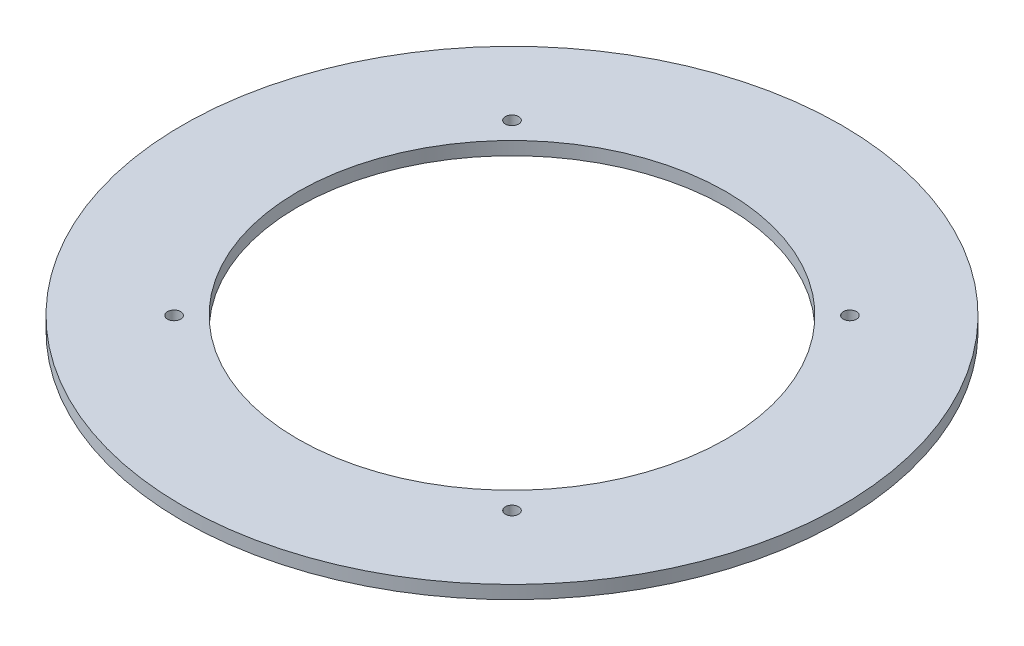
ISO-10303-21;
HEADER;
FILE_DESCRIPTION(('STEP AP214'),'2;1');
FILE_NAME('part.step','',(''),(''),'','','');
FILE_SCHEMA(('AUTOMOTIVE_DESIGN { 1 0 10303 214 1 1 1 1 }'));
ENDSEC;
DATA;
#1=APPLICATION_CONTEXT('core data for automotive mechanical design processes');
#2=APPLICATION_PROTOCOL_DEFINITION('international standard','automotive_design',2000,#1);
#3=PRODUCT_CONTEXT('',#1,'mechanical');
#4=PRODUCT('Part','Part','',(#3));
#5=PRODUCT_RELATED_PRODUCT_CATEGORY('part','',(#4));
#6=PRODUCT_DEFINITION_FORMATION('','',#4);
#7=PRODUCT_DEFINITION_CONTEXT('part definition',#1,'design');
#8=PRODUCT_DEFINITION('design','',#6,#7);
#9=PRODUCT_DEFINITION_SHAPE('','',#8);
#10=(LENGTH_UNIT() NAMED_UNIT(*) SI_UNIT(.MILLI.,.METRE.));
#11=(NAMED_UNIT(*) PLANE_ANGLE_UNIT() SI_UNIT($,.RADIAN.));
#12=(NAMED_UNIT(*) SI_UNIT($,.STERADIAN.) SOLID_ANGLE_UNIT());
#13=UNCERTAINTY_MEASURE_WITH_UNIT(LENGTH_MEASURE(1.E-05),#10,'distance_accuracy_value','');
#14=(GEOMETRIC_REPRESENTATION_CONTEXT(3) GLOBAL_UNCERTAINTY_ASSIGNED_CONTEXT((#13)) GLOBAL_UNIT_ASSIGNED_CONTEXT((#10,
#11,#12)) REPRESENTATION_CONTEXT('',''));
#15=CARTESIAN_POINT('',(0.,0.,0.));
#16=DIRECTION('',(0.,0.,1.));
#17=DIRECTION('',(1.,0.,0.));
#18=AXIS2_PLACEMENT_3D('',#15,#16,#17);
#19=CARTESIAN_POINT('',(0.,4.,0.));
#20=DIRECTION('',(0.,1.,0.));
#21=DIRECTION('',(0.,0.,1.));
#22=AXIS2_PLACEMENT_3D('',#19,#20,#21);
#23=PLANE('',#22);
#24=CARTESIAN_POINT('',(51.2652416360244,4.,51.2652416360249));
#25=DIRECTION('',(0.,-1.,0.));
#26=DIRECTION('',(0.,0.,1.));
#27=AXIS2_PLACEMENT_3D('',#24,#25,#26);
#28=CIRCLE('',#27,2.);
#29=CARTESIAN_POINT('',(51.2652416360244,4.,53.2652416360249));
#30=VERTEX_POINT('',#29);
#31=EDGE_CURVE('E62',#30,#30,#28,.T.);
#32=ORIENTED_EDGE('',*,*,#31,.T.);
#33=EDGE_LOOP('',(#32));
#34=FACE_BOUND('',#33,.T.);
#35=CARTESIAN_POINT('',(-51.2652416360244,4.,-51.265241636025));
#36=DIRECTION('',(0.,-1.,0.));
#37=DIRECTION('',(0.,0.,-1.));
#38=AXIS2_PLACEMENT_3D('',#35,#36,#37);
#39=CIRCLE('',#38,2.);
#40=CARTESIAN_POINT('',(-51.2652416360244,4.,-53.265241636025));
#41=VERTEX_POINT('',#40);
#42=EDGE_CURVE('E68',#41,#41,#39,.T.);
#43=ORIENTED_EDGE('',*,*,#42,.T.);
#44=EDGE_LOOP('',(#43));
#45=FACE_BOUND('',#44,.T.);
#46=CARTESIAN_POINT('',(51.265241636025,4.,-51.2652416360244));
#47=DIRECTION('',(0.,-1.,0.));
#48=DIRECTION('',(0.,0.,1.));
#49=AXIS2_PLACEMENT_3D('',#46,#47,#48);
#50=CIRCLE('',#49,2.);
#51=CARTESIAN_POINT('',(51.265241636025,4.,-49.2652416360244));
#52=VERTEX_POINT('',#51);
#53=EDGE_CURVE('E56',#52,#52,#50,.T.);
#54=ORIENTED_EDGE('',*,*,#53,.T.);
#55=EDGE_LOOP('',(#54));
#56=FACE_BOUND('',#55,.T.);
#57=CARTESIAN_POINT('',(-51.265241636025,4.,51.2652416360244));
#58=DIRECTION('',(0.,-1.,0.));
#59=DIRECTION('',(0.,0.,-1.));
#60=AXIS2_PLACEMENT_3D('',#57,#58,#59);
#61=CIRCLE('',#60,2.);
#62=CARTESIAN_POINT('',(-51.265241636025,4.,49.2652416360244));
#63=VERTEX_POINT('',#62);
#64=EDGE_CURVE('E50',#63,#63,#61,.T.);
#65=ORIENTED_EDGE('',*,*,#64,.T.);
#66=EDGE_LOOP('',(#65));
#67=FACE_BOUND('',#66,.T.);
#68=CARTESIAN_POINT('',(0.,4.,0.));
#69=DIRECTION('',(0.,1.,0.));
#70=DIRECTION('',(0.,0.,1.));
#71=AXIS2_PLACEMENT_3D('',#68,#69,#70);
#72=CIRCLE('',#71,100.);
#73=CARTESIAN_POINT('',(0.,4.,100.));
#74=VERTEX_POINT('',#73);
#75=EDGE_CURVE('E10',#74,#74,#72,.T.);
#76=ORIENTED_EDGE('',*,*,#75,.T.);
#77=EDGE_LOOP('',(#76));
#78=FACE_BOUND('',#77,.T.);
#79=CARTESIAN_POINT('',(0.,4.,0.));
#80=DIRECTION('',(0.,1.,0.));
#81=DIRECTION('',(0.,0.,1.));
#82=AXIS2_PLACEMENT_3D('',#79,#80,#81);
#83=CIRCLE('',#82,65.);
#84=CARTESIAN_POINT('',(0.,4.,65.));
#85=VERTEX_POINT('',#84);
#86=EDGE_CURVE('E45',#85,#85,#83,.T.);
#87=ORIENTED_EDGE('',*,*,#86,.F.);
#88=EDGE_LOOP('',(#87));
#89=FACE_BOUND('',#88,.T.);
#90=ADVANCED_FACE('F34',(#34,#45,#56,#67,#78,#89),#23,.T.);
#91=CARTESIAN_POINT('',(0.,0.,0.));
#92=DIRECTION('',(0.,1.,0.));
#93=DIRECTION('',(0.,0.,1.));
#94=AXIS2_PLACEMENT_3D('',#91,#92,#93);
#95=PLANE('',#94);
#96=CARTESIAN_POINT('',(51.2652416360244,0.,51.2652416360249));
#97=DIRECTION('',(0.,-1.,0.));
#98=DIRECTION('',(0.,0.,1.));
#99=AXIS2_PLACEMENT_3D('',#96,#97,#98);
#100=CIRCLE('',#99,2.);
#101=CARTESIAN_POINT('',(51.2652416360244,0.,53.2652416360249));
#102=VERTEX_POINT('',#101);
#103=EDGE_CURVE('E59',#102,#102,#100,.T.);
#104=ORIENTED_EDGE('',*,*,#103,.F.);
#105=EDGE_LOOP('',(#104));
#106=FACE_BOUND('',#105,.T.);
#107=CARTESIAN_POINT('',(-51.2652416360244,0.,-51.265241636025));
#108=DIRECTION('',(0.,-1.,0.));
#109=DIRECTION('',(0.,0.,-1.));
#110=AXIS2_PLACEMENT_3D('',#107,#108,#109);
#111=CIRCLE('',#110,2.);
#112=CARTESIAN_POINT('',(-51.2652416360244,0.,-53.265241636025));
#113=VERTEX_POINT('',#112);
#114=EDGE_CURVE('E65',#113,#113,#111,.T.);
#115=ORIENTED_EDGE('',*,*,#114,.F.);
#116=EDGE_LOOP('',(#115));
#117=FACE_BOUND('',#116,.T.);
#118=CARTESIAN_POINT('',(51.265241636025,0.,-51.2652416360244));
#119=DIRECTION('',(0.,-1.,0.));
#120=DIRECTION('',(0.,0.,1.));
#121=AXIS2_PLACEMENT_3D('',#118,#119,#120);
#122=CIRCLE('',#121,2.);
#123=CARTESIAN_POINT('',(51.265241636025,0.,-49.2652416360244));
#124=VERTEX_POINT('',#123);
#125=EDGE_CURVE('E71',#124,#124,#122,.T.);
#126=ORIENTED_EDGE('',*,*,#125,.F.);
#127=EDGE_LOOP('',(#126));
#128=FACE_BOUND('',#127,.T.);
#129=CARTESIAN_POINT('',(-51.265241636025,0.,51.2652416360244));
#130=DIRECTION('',(0.,-1.,0.));
#131=DIRECTION('',(0.,0.,-1.));
#132=AXIS2_PLACEMENT_3D('',#129,#130,#131);
#133=CIRCLE('',#132,2.);
#134=CARTESIAN_POINT('',(-51.265241636025,0.,49.2652416360244));
#135=VERTEX_POINT('',#134);
#136=EDGE_CURVE('E53',#135,#135,#133,.T.);
#137=ORIENTED_EDGE('',*,*,#136,.F.);
#138=EDGE_LOOP('',(#137));
#139=FACE_BOUND('',#138,.T.);
#140=CARTESIAN_POINT('',(0.,0.,0.));
#141=DIRECTION('',(0.,1.,0.));
#142=DIRECTION('',(0.,0.,1.));
#143=AXIS2_PLACEMENT_3D('',#140,#141,#142);
#144=CIRCLE('',#143,100.);
#145=CARTESIAN_POINT('',(0.,0.,100.));
#146=VERTEX_POINT('',#145);
#147=EDGE_CURVE('E38',#146,#146,#144,.T.);
#148=ORIENTED_EDGE('',*,*,#147,.F.);
#149=EDGE_LOOP('',(#148));
#150=FACE_BOUND('',#149,.T.);
#151=CARTESIAN_POINT('',(0.,0.,0.));
#152=DIRECTION('',(0.,1.,0.));
#153=DIRECTION('',(0.,0.,1.));
#154=AXIS2_PLACEMENT_3D('',#151,#152,#153);
#155=CIRCLE('',#154,65.);
#156=CARTESIAN_POINT('',(0.,0.,65.));
#157=VERTEX_POINT('',#156);
#158=EDGE_CURVE('E47',#157,#157,#155,.T.);
#159=ORIENTED_EDGE('',*,*,#158,.T.);
#160=EDGE_LOOP('',(#159));
#161=FACE_BOUND('',#160,.T.);
#162=ADVANCED_FACE('F87',(#106,#117,#128,#139,#150,#161),#95,.F.);
#163=CARTESIAN_POINT('',(0.,4.,0.));
#164=DIRECTION('',(0.,-1.,0.));
#165=DIRECTION('',(0.,0.,-1.));
#166=AXIS2_PLACEMENT_3D('',#163,#164,#165);
#167=CYLINDRICAL_SURFACE('',#166,100.);
#168=ORIENTED_EDGE('',*,*,#75,.F.);
#169=EDGE_LOOP('',(#168));
#170=FACE_BOUND('',#169,.T.);
#171=ORIENTED_EDGE('',*,*,#147,.T.);
#172=EDGE_LOOP('',(#171));
#173=FACE_BOUND('',#172,.T.);
#174=ADVANCED_FACE('F36',(#170,#173),#167,.T.);
#175=CARTESIAN_POINT('',(0.,4.,0.));
#176=DIRECTION('',(0.,-1.,0.));
#177=DIRECTION('',(0.,0.,-1.));
#178=AXIS2_PLACEMENT_3D('',#175,#176,#177);
#179=CYLINDRICAL_SURFACE('',#178,65.);
#180=ORIENTED_EDGE('',*,*,#86,.T.);
#181=EDGE_LOOP('',(#180));
#182=FACE_BOUND('',#181,.T.);
#183=ORIENTED_EDGE('',*,*,#158,.F.);
#184=EDGE_LOOP('',(#183));
#185=FACE_BOUND('',#184,.T.);
#186=ADVANCED_FACE('F97',(#182,#185),#179,.F.);
#187=CARTESIAN_POINT('',(-51.265241636025,4.,51.2652416360244));
#188=DIRECTION('',(0.,-1.,0.));
#189=DIRECTION('',(0.,0.,-1.));
#190=AXIS2_PLACEMENT_3D('',#187,#188,#189);
#191=CYLINDRICAL_SURFACE('',#190,2.);
#192=ORIENTED_EDGE('',*,*,#64,.F.);
#193=EDGE_LOOP('',(#192));
#194=FACE_BOUND('',#193,.T.);
#195=ORIENTED_EDGE('',*,*,#136,.T.);
#196=EDGE_LOOP('',(#195));
#197=FACE_BOUND('',#196,.T.);
#198=ADVANCED_FACE('F83',(#194,#197),#191,.F.);
#199=CARTESIAN_POINT('',(51.265241636025,4.,-51.2652416360244));
#200=DIRECTION('',(0.,-1.,0.));
#201=DIRECTION('',(0.,0.,-1.));
#202=AXIS2_PLACEMENT_3D('',#199,#200,#201);
#203=CYLINDRICAL_SURFACE('',#202,2.);
#204=ORIENTED_EDGE('',*,*,#53,.F.);
#205=EDGE_LOOP('',(#204));
#206=FACE_BOUND('',#205,.T.);
#207=ORIENTED_EDGE('',*,*,#125,.T.);
#208=EDGE_LOOP('',(#207));
#209=FACE_BOUND('',#208,.T.);
#210=ADVANCED_FACE('F79',(#206,#209),#203,.F.);
#211=CARTESIAN_POINT('',(-51.2652416360244,4.,-51.265241636025));
#212=DIRECTION('',(0.,-1.,0.));
#213=DIRECTION('',(0.,0.,-1.));
#214=AXIS2_PLACEMENT_3D('',#211,#212,#213);
#215=CYLINDRICAL_SURFACE('',#214,2.);
#216=ORIENTED_EDGE('',*,*,#42,.F.);
#217=EDGE_LOOP('',(#216));
#218=FACE_BOUND('',#217,.T.);
#219=ORIENTED_EDGE('',*,*,#114,.T.);
#220=EDGE_LOOP('',(#219));
#221=FACE_BOUND('',#220,.T.);
#222=ADVANCED_FACE('F82',(#218,#221),#215,.F.);
#223=CARTESIAN_POINT('',(51.2652416360244,4.,51.2652416360249));
#224=DIRECTION('',(0.,-1.,0.));
#225=DIRECTION('',(0.,0.,-1.));
#226=AXIS2_PLACEMENT_3D('',#223,#224,#225);
#227=CYLINDRICAL_SURFACE('',#226,2.);
#228=ORIENTED_EDGE('',*,*,#31,.F.);
#229=EDGE_LOOP('',(#228));
#230=FACE_BOUND('',#229,.T.);
#231=ORIENTED_EDGE('',*,*,#103,.T.);
#232=EDGE_LOOP('',(#231));
#233=FACE_BOUND('',#232,.T.);
#234=ADVANCED_FACE('F119',(#230,#233),#227,.F.);
#235=CLOSED_SHELL('',(#90,#162,#174,#186,#198,#210,#222,#234));
#236=MANIFOLD_SOLID_BREP('B2',#235);
#237=ADVANCED_BREP_SHAPE_REPRESENTATION('',(#18,#236),#14);
#238=SHAPE_DEFINITION_REPRESENTATION(#9,#237);
ENDSEC;
END-ISO-10303-21;
